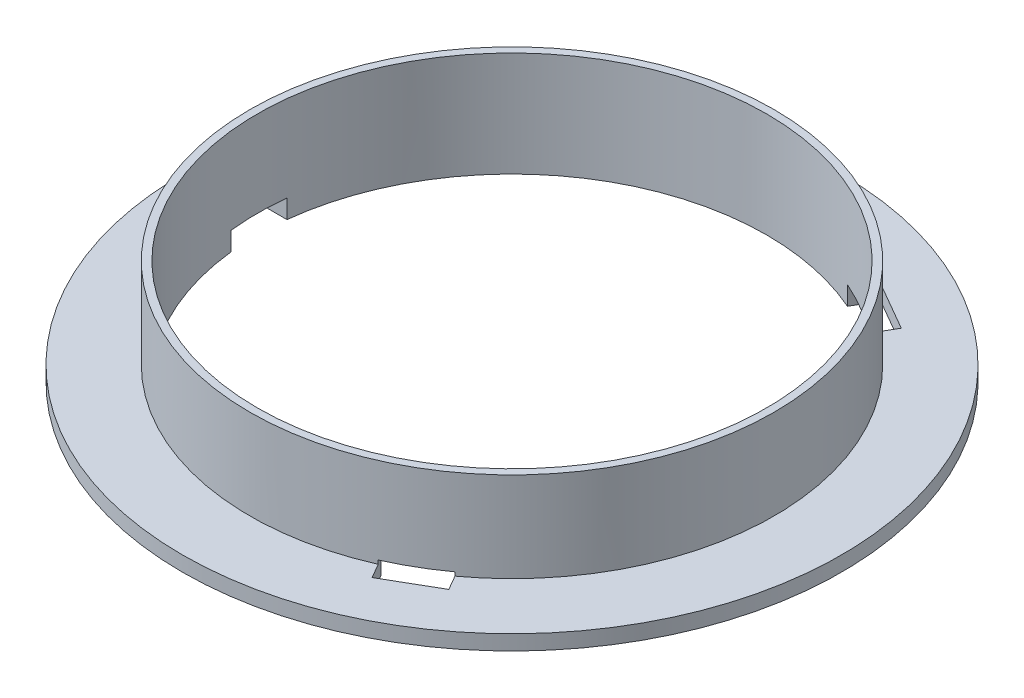
ISO-10303-21;
HEADER;
FILE_DESCRIPTION(('STEP AP214'),'2;1');
FILE_NAME('part.step','',(''),(''),'','','');
FILE_SCHEMA(('AUTOMOTIVE_DESIGN { 1 0 10303 214 1 1 1 1 }'));
ENDSEC;
DATA;
#1=APPLICATION_CONTEXT('core data for automotive mechanical design processes');
#2=APPLICATION_PROTOCOL_DEFINITION('international standard','automotive_design',2000,#1);
#3=PRODUCT_CONTEXT('',#1,'mechanical');
#4=PRODUCT('Part','Part','',(#3));
#5=PRODUCT_RELATED_PRODUCT_CATEGORY('part','',(#4));
#6=PRODUCT_DEFINITION_FORMATION('','',#4);
#7=PRODUCT_DEFINITION_CONTEXT('part definition',#1,'design');
#8=PRODUCT_DEFINITION('design','',#6,#7);
#9=PRODUCT_DEFINITION_SHAPE('','',#8);
#10=(LENGTH_UNIT() NAMED_UNIT(*) SI_UNIT(.MILLI.,.METRE.));
#11=(NAMED_UNIT(*) PLANE_ANGLE_UNIT() SI_UNIT($,.RADIAN.));
#12=(NAMED_UNIT(*) SI_UNIT($,.STERADIAN.) SOLID_ANGLE_UNIT());
#13=UNCERTAINTY_MEASURE_WITH_UNIT(LENGTH_MEASURE(1.E-05),#10,'distance_accuracy_value','');
#14=(GEOMETRIC_REPRESENTATION_CONTEXT(3) GLOBAL_UNCERTAINTY_ASSIGNED_CONTEXT((#13)) GLOBAL_UNIT_ASSIGNED_CONTEXT((#10,
#11,#12)) REPRESENTATION_CONTEXT('',''));
#15=CARTESIAN_POINT('',(0.,0.,0.));
#16=DIRECTION('',(0.,0.,1.));
#17=DIRECTION('',(1.,0.,0.));
#18=AXIS2_PLACEMENT_3D('',#15,#16,#17);
#19=CARTESIAN_POINT('',(0.,0.,0.));
#20=DIRECTION('',(0.,-1.,0.));
#21=DIRECTION('',(0.,0.,-1.));
#22=AXIS2_PLACEMENT_3D('',#19,#20,#21);
#23=CYLINDRICAL_SURFACE('',#22,34.);
#24=DIRECTION('',(0.,-1.,0.));
#25=VECTOR('',#24,1.);
#26=CARTESIAN_POINT('',(-33.7925657504724,2.5,-3.75));
#27=LINE('',#26,#25);
#28=CARTESIAN_POINT('',(-33.7925657504724,2.5,-3.75));
#29=VERTEX_POINT('',#28);
#30=CARTESIAN_POINT('',(-33.7925657504724,0.,-3.75));
#31=VERTEX_POINT('',#30);
#32=EDGE_CURVE('E270',#29,#31,#27,.T.);
#33=ORIENTED_EDGE('',*,*,#32,.T.);
#34=CARTESIAN_POINT('',(0.,0.,0.));
#35=DIRECTION('',(0.,-1.,0.));
#36=DIRECTION('',(0.,0.,-1.));
#37=AXIS2_PLACEMENT_3D('',#34,#35,#36);
#38=CIRCLE('',#37,34.);
#39=CARTESIAN_POINT('',(13.6486876110446,0.,-31.140220398965));
#40=VERTEX_POINT('',#39);
#41=EDGE_CURVE('E312',#31,#40,#38,.T.);
#42=ORIENTED_EDGE('',*,*,#41,.T.);
#43=DIRECTION('',(0.,-1.,0.));
#44=VECTOR('',#43,1.);
#45=CARTESIAN_POINT('',(13.6486876110446,2.5,-31.140220398965));
#46=LINE('',#45,#44);
#47=CARTESIAN_POINT('',(13.6486876110446,2.5,-31.140220398965));
#48=VERTEX_POINT('',#47);
#49=EDGE_CURVE('E248',#48,#40,#46,.T.);
#50=ORIENTED_EDGE('',*,*,#49,.F.);
#51=CARTESIAN_POINT('',(0.,2.5,0.));
#52=DIRECTION('',(0.,-1.,0.));
#53=DIRECTION('',(0.,0.,-1.));
#54=AXIS2_PLACEMENT_3D('',#51,#52,#53);
#55=CIRCLE('',#54,34.);
#56=CARTESIAN_POINT('',(20.1438781394279,2.5,-27.390220398965));
#57=VERTEX_POINT('',#56);
#58=EDGE_CURVE('E265',#48,#57,#55,.T.);
#59=ORIENTED_EDGE('',*,*,#58,.T.);
#60=DIRECTION('',(0.,-1.,0.));
#61=VECTOR('',#60,1.);
#62=CARTESIAN_POINT('',(20.1438781394279,2.5,-27.390220398965));
#63=LINE('',#62,#61);
#64=CARTESIAN_POINT('',(20.1438781394279,0.,-27.390220398965));
#65=VERTEX_POINT('',#64);
#66=EDGE_CURVE('E244',#57,#65,#63,.T.);
#67=ORIENTED_EDGE('',*,*,#66,.T.);
#68=CARTESIAN_POINT('',(20.1438781394278,0.,27.3902203989651));
#69=VERTEX_POINT('',#68);
#70=EDGE_CURVE('E316',#65,#69,#38,.T.);
#71=ORIENTED_EDGE('',*,*,#70,.T.);
#72=DIRECTION('',(0.,-1.,0.));
#73=VECTOR('',#72,1.);
#74=CARTESIAN_POINT('',(20.1438781394278,2.5,27.3902203989651));
#75=LINE('',#74,#73);
#76=CARTESIAN_POINT('',(20.1438781394278,2.5,27.3902203989651));
#77=VERTEX_POINT('',#76);
#78=EDGE_CURVE('E219',#77,#69,#75,.T.);
#79=ORIENTED_EDGE('',*,*,#78,.F.);
#80=CARTESIAN_POINT('',(0.,2.5,0.));
#81=DIRECTION('',(0.,-1.,0.));
#82=DIRECTION('',(0.,0.,-1.));
#83=AXIS2_PLACEMENT_3D('',#80,#81,#82);
#84=CIRCLE('',#83,34.);
#85=CARTESIAN_POINT('',(13.6486876110445,2.5,31.1402203989651));
#86=VERTEX_POINT('',#85);
#87=EDGE_CURVE('E276',#77,#86,#84,.T.);
#88=ORIENTED_EDGE('',*,*,#87,.T.);
#89=DIRECTION('',(0.,-1.,0.));
#90=VECTOR('',#89,1.);
#91=CARTESIAN_POINT('',(13.6486876110445,2.5,31.1402203989651));
#92=LINE('',#91,#90);
#93=CARTESIAN_POINT('',(13.6486876110445,0.,31.1402203989651));
#94=VERTEX_POINT('',#93);
#95=EDGE_CURVE('E216',#86,#94,#92,.T.);
#96=ORIENTED_EDGE('',*,*,#95,.T.);
#97=CARTESIAN_POINT('',(-33.7925657504724,0.,3.75));
#98=VERTEX_POINT('',#97);
#99=EDGE_CURVE('E198',#94,#98,#38,.T.);
#100=ORIENTED_EDGE('',*,*,#99,.T.);
#101=DIRECTION('',(0.,-1.,0.));
#102=VECTOR('',#101,1.);
#103=CARTESIAN_POINT('',(-33.7925657504724,2.5,3.75));
#104=LINE('',#103,#102);
#105=CARTESIAN_POINT('',(-33.7925657504724,2.5,3.75));
#106=VERTEX_POINT('',#105);
#107=EDGE_CURVE('E186',#106,#98,#104,.T.);
#108=ORIENTED_EDGE('',*,*,#107,.F.);
#109=CARTESIAN_POINT('',(0.,2.5,0.));
#110=DIRECTION('',(0.,1.,0.));
#111=DIRECTION('',(0.,0.,1.));
#112=AXIS2_PLACEMENT_3D('',#109,#110,#111);
#113=CIRCLE('',#112,34.);
#114=EDGE_CURVE('E168',#29,#106,#113,.T.);
#115=ORIENTED_EDGE('',*,*,#114,.F.);
#116=EDGE_LOOP('',(#33,#42,#50,#59,#67,#71,#79,#88,#96,#100,#108,#115));
#117=FACE_BOUND('',#116,.T.);
#118=CARTESIAN_POINT('',(0.,14.,0.));
#119=DIRECTION('',(0.,-1.,0.));
#120=DIRECTION('',(0.,0.,-1.));
#121=AXIS2_PLACEMENT_3D('',#118,#119,#120);
#122=CIRCLE('',#121,34.);
#123=CARTESIAN_POINT('',(0.,14.,-34.));
#124=VERTEX_POINT('',#123);
#125=EDGE_CURVE('E290',#124,#124,#122,.T.);
#126=ORIENTED_EDGE('',*,*,#125,.F.);
#127=EDGE_LOOP('',(#126));
#128=FACE_BOUND('',#127,.T.);
#129=ADVANCED_FACE('F43',(#117,#128),#23,.F.);
#130=CARTESIAN_POINT('',(0.,0.,-34.));
#131=DIRECTION('',(0.,-1.,0.));
#132=DIRECTION('',(0.,0.,-1.));
#133=AXIS2_PLACEMENT_3D('',#130,#131,#132);
#134=PLANE('',#133);
#135=DIRECTION('',(1.,0.,0.));
#136=VECTOR('',#135,1.);
#137=CARTESIAN_POINT('',(-37.0425657504724,0.,-3.75));
#138=LINE('',#137,#136);
#139=CARTESIAN_POINT('',(-37.0425657504724,0.,-3.75));
#140=VERTEX_POINT('',#139);
#141=EDGE_CURVE('E192',#140,#31,#138,.T.);
#142=ORIENTED_EDGE('',*,*,#141,.F.);
#143=DIRECTION('',(0.,0.,-1.));
#144=VECTOR('',#143,1.);
#145=CARTESIAN_POINT('',(-37.0425657504724,0.,-3.75));
#146=LINE('',#145,#144);
#147=CARTESIAN_POINT('',(-37.0425657504724,0.,3.75));
#148=VERTEX_POINT('',#147);
#149=EDGE_CURVE('E390',#148,#140,#146,.T.);
#150=ORIENTED_EDGE('',*,*,#149,.F.);
#151=DIRECTION('',(-1.,0.,0.));
#152=VECTOR('',#151,1.);
#153=CARTESIAN_POINT('',(-37.0425657504724,0.,3.75));
#154=LINE('',#153,#152);
#155=EDGE_CURVE('E232',#98,#148,#154,.T.);
#156=ORIENTED_EDGE('',*,*,#155,.F.);
#157=ORIENTED_EDGE('',*,*,#99,.F.);
#158=DIRECTION('',(-0.5,0.,-0.866025403784438));
#159=VECTOR('',#158,1.);
#160=CARTESIAN_POINT('',(15.2736876110445,0.,33.9548029612645));
#161=LINE('',#160,#159);
#162=CARTESIAN_POINT('',(15.2736876110445,0.,33.9548029612645));
#163=VERTEX_POINT('',#162);
#164=EDGE_CURVE('E222',#163,#94,#161,.T.);
#165=ORIENTED_EDGE('',*,*,#164,.F.);
#166=DIRECTION('',(-0.866025403784439,0.,0.5));
#167=VECTOR('',#166,1.);
#168=CARTESIAN_POINT('',(15.2736876110445,0.,33.9548029612645));
#169=LINE('',#168,#167);
#170=CARTESIAN_POINT('',(21.7688781394278,0.,30.2048029612645));
#171=VERTEX_POINT('',#170);
#172=EDGE_CURVE('E225',#171,#163,#169,.T.);
#173=ORIENTED_EDGE('',*,*,#172,.F.);
#174=DIRECTION('',(0.5,0.,0.866025403784438));
#175=VECTOR('',#174,1.);
#176=CARTESIAN_POINT('',(21.7688781394278,0.,30.2048029612645));
#177=LINE('',#176,#175);
#178=EDGE_CURVE('E58',#69,#171,#177,.T.);
#179=ORIENTED_EDGE('',*,*,#178,.F.);
#180=ORIENTED_EDGE('',*,*,#70,.F.);
#181=DIRECTION('',(-0.500000000000001,0.,0.866025403784438));
#182=VECTOR('',#181,1.);
#183=CARTESIAN_POINT('',(21.7688781394279,0.,-30.2048029612645));
#184=LINE('',#183,#182);
#185=CARTESIAN_POINT('',(21.7688781394279,0.,-30.2048029612645));
#186=VERTEX_POINT('',#185);
#187=EDGE_CURVE('E251',#186,#65,#184,.T.);
#188=ORIENTED_EDGE('',*,*,#187,.F.);
#189=DIRECTION('',(0.866025403784438,0.,0.500000000000001));
#190=VECTOR('',#189,1.);
#191=CARTESIAN_POINT('',(21.7688781394279,0.,-30.2048029612645));
#192=LINE('',#191,#190);
#193=CARTESIAN_POINT('',(15.2736876110446,0.,-33.9548029612645));
#194=VERTEX_POINT('',#193);
#195=EDGE_CURVE('E254',#194,#186,#192,.T.);
#196=ORIENTED_EDGE('',*,*,#195,.F.);
#197=DIRECTION('',(0.5,0.,-0.866025403784439));
#198=VECTOR('',#197,1.);
#199=CARTESIAN_POINT('',(15.2736876110446,0.,-33.9548029612645));
#200=LINE('',#199,#198);
#201=EDGE_CURVE('E66',#40,#194,#200,.T.);
#202=ORIENTED_EDGE('',*,*,#201,.F.);
#203=ORIENTED_EDGE('',*,*,#41,.F.);
#204=EDGE_LOOP('',(#142,#150,#156,#157,#165,#173,#179,#180,#188,#196,#202,#203));
#205=FACE_BOUND('',#204,.T.);
#206=CARTESIAN_POINT('',(0.,0.,0.));
#207=DIRECTION('',(0.,-1.,0.));
#208=DIRECTION('',(0.,0.,-1.));
#209=AXIS2_PLACEMENT_3D('',#206,#207,#208);
#210=CIRCLE('',#209,44.);
#211=CARTESIAN_POINT('',(0.,0.,-44.));
#212=VERTEX_POINT('',#211);
#213=EDGE_CURVE('E308',#212,#212,#210,.T.);
#214=ORIENTED_EDGE('',*,*,#213,.T.);
#215=EDGE_LOOP('',(#214));
#216=FACE_BOUND('',#215,.T.);
#217=ADVANCED_FACE('F398',(#205,#216),#134,.T.);
#218=CARTESIAN_POINT('',(0.,0.,0.));
#219=DIRECTION('',(0.,-1.,0.));
#220=DIRECTION('',(0.,0.,-1.));
#221=AXIS2_PLACEMENT_3D('',#218,#219,#220);
#222=CYLINDRICAL_SURFACE('',#221,44.);
#223=CARTESIAN_POINT('',(0.,2.,0.));
#224=DIRECTION('',(0.,-1.,0.));
#225=DIRECTION('',(0.,0.,-1.));
#226=AXIS2_PLACEMENT_3D('',#223,#224,#225);
#227=CIRCLE('',#226,44.);
#228=CARTESIAN_POINT('',(0.,2.,-44.));
#229=VERTEX_POINT('',#228);
#230=EDGE_CURVE('E304',#229,#229,#227,.T.);
#231=ORIENTED_EDGE('',*,*,#230,.T.);
#232=EDGE_LOOP('',(#231));
#233=FACE_BOUND('',#232,.T.);
#234=ORIENTED_EDGE('',*,*,#213,.F.);
#235=EDGE_LOOP('',(#234));
#236=FACE_BOUND('',#235,.T.);
#237=ADVANCED_FACE('F445',(#233,#236),#222,.T.);
#238=CARTESIAN_POINT('',(0.,2.,-44.));
#239=DIRECTION('',(0.,1.,0.));
#240=DIRECTION('',(0.,0.,1.));
#241=AXIS2_PLACEMENT_3D('',#238,#239,#240);
#242=PLANE('',#241);
#243=DIRECTION('',(-1.,0.,0.));
#244=VECTOR('',#243,1.);
#245=CARTESIAN_POINT('',(0.,2.,-3.74999999999999));
#246=LINE('',#245,#244);
#247=CARTESIAN_POINT('',(-34.7985272676876,2.,-3.75));
#248=VERTEX_POINT('',#247);
#249=CARTESIAN_POINT('',(-37.0425657504724,2.,-3.75));
#250=VERTEX_POINT('',#249);
#251=EDGE_CURVE('E287',#248,#250,#246,.T.);
#252=ORIENTED_EDGE('',*,*,#251,.F.);
#253=CARTESIAN_POINT('',(0.,2.,0.));
#254=DIRECTION('',(0.,-1.,0.));
#255=DIRECTION('',(0.,0.,-1.));
#256=AXIS2_PLACEMENT_3D('',#253,#254,#255);
#257=CIRCLE('',#256,35.);
#258=CARTESIAN_POINT('',(14.1516683696522,2.,-32.011408628103));
#259=VERTEX_POINT('',#258);
#260=EDGE_CURVE('E298',#248,#259,#257,.T.);
#261=ORIENTED_EDGE('',*,*,#260,.T.);
#262=DIRECTION('',(-0.5,0.,0.866025403784439));
#263=VECTOR('',#262,1.);
#264=CARTESIAN_POINT('',(15.804963619066,2.,-34.875));
#265=LINE('',#264,#263);
#266=CARTESIAN_POINT('',(15.2736876110446,2.,-33.9548029612645));
#267=VERTEX_POINT('',#266);
#268=EDGE_CURVE('E273',#267,#259,#265,.T.);
#269=ORIENTED_EDGE('',*,*,#268,.F.);
#270=DIRECTION('',(-0.866025403784438,0.,-0.500000000000001));
#271=VECTOR('',#270,1.);
#272=CARTESIAN_POINT('',(-0.531276008021443,2.,-43.0798029612645));
#273=LINE('',#272,#271);
#274=CARTESIAN_POINT('',(21.7688781394279,2.,-30.2048029612645));
#275=VERTEX_POINT('',#274);
#276=EDGE_CURVE('E347',#275,#267,#273,.T.);
#277=ORIENTED_EDGE('',*,*,#276,.F.);
#278=DIRECTION('',(0.500000000000001,0.,-0.866025403784438));
#279=VECTOR('',#278,1.);
#280=CARTESIAN_POINT('',(22.3001541474493,2.,-31.125));
#281=LINE('',#280,#279);
#282=CARTESIAN_POINT('',(20.6468588980355,2.,-28.261408628103));
#283=VERTEX_POINT('',#282);
#284=EDGE_CURVE('E269',#283,#275,#281,.T.);
#285=ORIENTED_EDGE('',*,*,#284,.F.);
#286=CARTESIAN_POINT('',(20.6468588980355,2.,28.261408628103));
#287=VERTEX_POINT('',#286);
#288=EDGE_CURVE('E303',#283,#287,#257,.T.);
#289=ORIENTED_EDGE('',*,*,#288,.T.);
#290=DIRECTION('',(-0.5,0.,-0.866025403784438));
#291=VECTOR('',#290,1.);
#292=CARTESIAN_POINT('',(-15.804963619066,2.,-34.875));
#293=LINE('',#292,#291);
#294=CARTESIAN_POINT('',(21.7688781394278,2.,30.2048029612645));
#295=VERTEX_POINT('',#294);
#296=EDGE_CURVE('E181',#295,#287,#293,.T.);
#297=ORIENTED_EDGE('',*,*,#296,.F.);
#298=DIRECTION('',(0.866025403784439,0.,-0.5));
#299=VECTOR('',#298,1.);
#300=CARTESIAN_POINT('',(37.5738417584938,2.,21.0798029612645));
#301=LINE('',#300,#299);
#302=CARTESIAN_POINT('',(15.2736876110445,2.,33.9548029612645));
#303=VERTEX_POINT('',#302);
#304=EDGE_CURVE('E51',#303,#295,#301,.T.);
#305=ORIENTED_EDGE('',*,*,#304,.F.);
#306=DIRECTION('',(0.5,0.,0.866025403784438));
#307=VECTOR('',#306,1.);
#308=CARTESIAN_POINT('',(-22.3001541474493,2.,-31.125));
#309=LINE('',#308,#307);
#310=CARTESIAN_POINT('',(14.1516683696522,2.,32.011408628103));
#311=VERTEX_POINT('',#310);
#312=EDGE_CURVE('E280',#311,#303,#309,.T.);
#313=ORIENTED_EDGE('',*,*,#312,.F.);
#314=CARTESIAN_POINT('',(-34.7985272676876,2.,3.75));
#315=VERTEX_POINT('',#314);
#316=EDGE_CURVE('E302',#311,#315,#257,.T.);
#317=ORIENTED_EDGE('',*,*,#316,.T.);
#318=DIRECTION('',(1.,0.,0.));
#319=VECTOR('',#318,1.);
#320=CARTESIAN_POINT('',(0.,2.,3.75));
#321=LINE('',#320,#319);
#322=CARTESIAN_POINT('',(-37.0425657504724,2.,3.75));
#323=VERTEX_POINT('',#322);
#324=EDGE_CURVE('E180',#323,#315,#321,.T.);
#325=ORIENTED_EDGE('',*,*,#324,.F.);
#326=DIRECTION('',(0.,0.,1.));
#327=VECTOR('',#326,1.);
#328=CARTESIAN_POINT('',(-37.0425657504724,2.,-44.));
#329=LINE('',#328,#327);
#330=EDGE_CURVE('E11',#250,#323,#329,.T.);
#331=ORIENTED_EDGE('',*,*,#330,.F.);
#332=EDGE_LOOP('',(#252,#261,#269,#277,#285,#289,#297,#305,#313,#317,#325,#331));
#333=FACE_BOUND('',#332,.T.);
#334=ORIENTED_EDGE('',*,*,#230,.F.);
#335=EDGE_LOOP('',(#334));
#336=FACE_BOUND('',#335,.T.);
#337=ADVANCED_FACE('F362',(#333,#336),#242,.T.);
#338=CARTESIAN_POINT('',(0.,0.,0.));
#339=DIRECTION('',(0.,-1.,0.));
#340=DIRECTION('',(0.,0.,-1.));
#341=AXIS2_PLACEMENT_3D('',#338,#339,#340);
#342=CYLINDRICAL_SURFACE('',#341,35.);
#343=DIRECTION('',(0.,-1.,0.));
#344=VECTOR('',#343,1.);
#345=CARTESIAN_POINT('',(-34.7985272676876,0.,-3.75));
#346=LINE('',#345,#344);
#347=CARTESIAN_POINT('',(-34.7985272676876,2.5,-3.75));
#348=VERTEX_POINT('',#347);
#349=EDGE_CURVE('E344',#348,#248,#346,.T.);
#350=ORIENTED_EDGE('',*,*,#349,.F.);
#351=CARTESIAN_POINT('',(0.,2.5,0.));
#352=DIRECTION('',(0.,1.,0.));
#353=DIRECTION('',(0.,0.,1.));
#354=AXIS2_PLACEMENT_3D('',#351,#352,#353);
#355=CIRCLE('',#354,35.);
#356=CARTESIAN_POINT('',(-34.7985272676876,2.5,3.75));
#357=VERTEX_POINT('',#356);
#358=EDGE_CURVE('E339',#357,#348,#355,.F.);
#359=ORIENTED_EDGE('',*,*,#358,.F.);
#360=DIRECTION('',(0.,-1.,0.));
#361=VECTOR('',#360,1.);
#362=CARTESIAN_POINT('',(-34.7985272676876,0.,3.75));
#363=LINE('',#362,#361);
#364=EDGE_CURVE('E189',#315,#357,#363,.F.);
#365=ORIENTED_EDGE('',*,*,#364,.F.);
#366=ORIENTED_EDGE('',*,*,#316,.F.);
#367=DIRECTION('',(0.,-1.,0.));
#368=VECTOR('',#367,1.);
#369=CARTESIAN_POINT('',(14.1516683696522,0.,32.011408628103));
#370=LINE('',#369,#368);
#371=CARTESIAN_POINT('',(14.1516683696522,2.5,32.011408628103));
#372=VERTEX_POINT('',#371);
#373=EDGE_CURVE('E332',#372,#311,#370,.T.);
#374=ORIENTED_EDGE('',*,*,#373,.F.);
#375=CARTESIAN_POINT('',(0.,2.5,0.));
#376=DIRECTION('',(0.,-1.,0.));
#377=DIRECTION('',(0.,0.,-1.));
#378=AXIS2_PLACEMENT_3D('',#375,#376,#377);
#379=CIRCLE('',#378,35.);
#380=CARTESIAN_POINT('',(20.6468588980355,2.5,28.261408628103));
#381=VERTEX_POINT('',#380);
#382=EDGE_CURVE('E328',#372,#381,#379,.F.);
#383=ORIENTED_EDGE('',*,*,#382,.T.);
#384=DIRECTION('',(0.,-1.,0.));
#385=VECTOR('',#384,1.);
#386=CARTESIAN_POINT('',(20.6468588980355,0.,28.261408628103));
#387=LINE('',#386,#385);
#388=EDGE_CURVE('E335',#287,#381,#387,.F.);
#389=ORIENTED_EDGE('',*,*,#388,.F.);
#390=ORIENTED_EDGE('',*,*,#288,.F.);
#391=DIRECTION('',(0.,-1.,0.));
#392=VECTOR('',#391,1.);
#393=CARTESIAN_POINT('',(20.6468588980355,0.,-28.261408628103));
#394=LINE('',#393,#392);
#395=CARTESIAN_POINT('',(20.6468588980355,2.5,-28.261408628103));
#396=VERTEX_POINT('',#395);
#397=EDGE_CURVE('E321',#396,#283,#394,.T.);
#398=ORIENTED_EDGE('',*,*,#397,.F.);
#399=CARTESIAN_POINT('',(0.,2.5,0.));
#400=DIRECTION('',(0.,-1.,0.));
#401=DIRECTION('',(0.,0.,-1.));
#402=AXIS2_PLACEMENT_3D('',#399,#400,#401);
#403=CIRCLE('',#402,35.);
#404=CARTESIAN_POINT('',(14.1516683696522,2.5,-32.011408628103));
#405=VERTEX_POINT('',#404);
#406=EDGE_CURVE('E317',#396,#405,#403,.F.);
#407=ORIENTED_EDGE('',*,*,#406,.T.);
#408=DIRECTION('',(0.,-1.,0.));
#409=VECTOR('',#408,1.);
#410=CARTESIAN_POINT('',(14.1516683696522,0.,-32.011408628103));
#411=LINE('',#410,#409);
#412=EDGE_CURVE('E324',#259,#405,#411,.F.);
#413=ORIENTED_EDGE('',*,*,#412,.F.);
#414=ORIENTED_EDGE('',*,*,#260,.F.);
#415=EDGE_LOOP('',(#350,#359,#365,#366,#374,#383,#389,#390,#398,#407,#413,#414));
#416=FACE_BOUND('',#415,.T.);
#417=CARTESIAN_POINT('',(0.,14.,0.));
#418=DIRECTION('',(0.,-1.,0.));
#419=DIRECTION('',(0.,0.,-1.));
#420=AXIS2_PLACEMENT_3D('',#417,#418,#419);
#421=CIRCLE('',#420,35.);
#422=CARTESIAN_POINT('',(0.,14.,-35.));
#423=VERTEX_POINT('',#422);
#424=EDGE_CURVE('E294',#423,#423,#421,.T.);
#425=ORIENTED_EDGE('',*,*,#424,.T.);
#426=EDGE_LOOP('',(#425));
#427=FACE_BOUND('',#426,.T.);
#428=ADVANCED_FACE('F377',(#416,#427),#342,.T.);
#429=CARTESIAN_POINT('',(0.,14.,-35.));
#430=DIRECTION('',(0.,1.,0.));
#431=DIRECTION('',(0.,0.,1.));
#432=AXIS2_PLACEMENT_3D('',#429,#430,#431);
#433=PLANE('',#432);
#434=ORIENTED_EDGE('',*,*,#125,.T.);
#435=EDGE_LOOP('',(#434));
#436=FACE_BOUND('',#435,.T.);
#437=ORIENTED_EDGE('',*,*,#424,.F.);
#438=EDGE_LOOP('',(#437));
#439=FACE_BOUND('',#438,.T.);
#440=ADVANCED_FACE('F456',(#436,#439),#433,.T.);
#441=CARTESIAN_POINT('',(15.2736876110446,2.5,-33.9548029612645));
#442=DIRECTION('',(-0.866025403784439,0.,-0.5));
#443=DIRECTION('',(-0.5,0.,0.866025403784439));
#444=AXIS2_PLACEMENT_3D('',#441,#442,#443);
#445=PLANE('',#444);
#446=ORIENTED_EDGE('',*,*,#268,.T.);
#447=ORIENTED_EDGE('',*,*,#412,.T.);
#448=DIRECTION('',(0.5,0.,-0.866025403784439));
#449=VECTOR('',#448,1.);
#450=CARTESIAN_POINT('',(15.2736876110446,2.5,-33.9548029612645));
#451=LINE('',#450,#449);
#452=EDGE_CURVE('E255',#48,#405,#451,.T.);
#453=ORIENTED_EDGE('',*,*,#452,.F.);
#454=ORIENTED_EDGE('',*,*,#49,.T.);
#455=ORIENTED_EDGE('',*,*,#201,.T.);
#456=DIRECTION('',(0.,-1.,0.));
#457=VECTOR('',#456,1.);
#458=CARTESIAN_POINT('',(15.2736876110446,2.5,-33.9548029612645));
#459=LINE('',#458,#457);
#460=EDGE_CURVE('E237',#267,#194,#459,.T.);
#461=ORIENTED_EDGE('',*,*,#460,.F.);
#462=EDGE_LOOP('',(#446,#447,#453,#454,#455,#461));
#463=FACE_BOUND('',#462,.T.);
#464=ADVANCED_FACE('F406',(#463),#445,.F.);
#465=CARTESIAN_POINT('',(21.7688781394279,2.5,-30.2048029612645));
#466=DIRECTION('',(0.866025403784438,0.,0.500000000000001));
#467=DIRECTION('',(0.500000000000001,0.,-0.866025403784438));
#468=AXIS2_PLACEMENT_3D('',#465,#466,#467);
#469=PLANE('',#468);
#470=ORIENTED_EDGE('',*,*,#284,.T.);
#471=DIRECTION('',(0.,-1.,0.));
#472=VECTOR('',#471,1.);
#473=CARTESIAN_POINT('',(21.7688781394279,2.5,-30.2048029612645));
#474=LINE('',#473,#472);
#475=EDGE_CURVE('E241',#275,#186,#474,.T.);
#476=ORIENTED_EDGE('',*,*,#475,.T.);
#477=ORIENTED_EDGE('',*,*,#187,.T.);
#478=ORIENTED_EDGE('',*,*,#66,.F.);
#479=DIRECTION('',(-0.500000000000001,0.,0.866025403784438));
#480=VECTOR('',#479,1.);
#481=CARTESIAN_POINT('',(21.7688781394279,2.5,-30.2048029612645));
#482=LINE('',#481,#480);
#483=EDGE_CURVE('E240',#396,#57,#482,.T.);
#484=ORIENTED_EDGE('',*,*,#483,.F.);
#485=ORIENTED_EDGE('',*,*,#397,.T.);
#486=EDGE_LOOP('',(#470,#476,#477,#478,#484,#485));
#487=FACE_BOUND('',#486,.T.);
#488=ADVANCED_FACE('F414',(#487),#469,.F.);
#489=CARTESIAN_POINT('',(21.7688781394279,2.5,-30.2048029612645));
#490=DIRECTION('',(0.500000000000001,0.,-0.866025403784438));
#491=DIRECTION('',(-0.866025403784438,0.,-0.500000000000001));
#492=AXIS2_PLACEMENT_3D('',#489,#490,#491);
#493=PLANE('',#492);
#494=ORIENTED_EDGE('',*,*,#276,.T.);
#495=ORIENTED_EDGE('',*,*,#460,.T.);
#496=ORIENTED_EDGE('',*,*,#195,.T.);
#497=ORIENTED_EDGE('',*,*,#475,.F.);
#498=EDGE_LOOP('',(#494,#495,#496,#497));
#499=FACE_BOUND('',#498,.T.);
#500=ADVANCED_FACE('F410',(#499),#493,.F.);
#501=CARTESIAN_POINT('',(0.,2.5,0.));
#502=DIRECTION('',(0.,-1.,0.));
#503=DIRECTION('',(0.,0.,-1.));
#504=AXIS2_PLACEMENT_3D('',#501,#502,#503);
#505=PLANE('',#504);
#506=ORIENTED_EDGE('',*,*,#452,.T.);
#507=ORIENTED_EDGE('',*,*,#406,.F.);
#508=ORIENTED_EDGE('',*,*,#483,.T.);
#509=ORIENTED_EDGE('',*,*,#58,.F.);
#510=EDGE_LOOP('',(#506,#507,#508,#509));
#511=FACE_BOUND('',#510,.T.);
#512=ADVANCED_FACE('F418',(#511),#505,.T.);
#513=CARTESIAN_POINT('',(21.7688781394278,2.5,30.2048029612645));
#514=DIRECTION('',(0.866025403784438,0.,-0.5));
#515=DIRECTION('',(-0.5,0.,-0.866025403784438));
#516=AXIS2_PLACEMENT_3D('',#513,#514,#515);
#517=PLANE('',#516);
#518=ORIENTED_EDGE('',*,*,#296,.T.);
#519=ORIENTED_EDGE('',*,*,#388,.T.);
#520=DIRECTION('',(0.5,0.,0.866025403784438));
#521=VECTOR('',#520,1.);
#522=CARTESIAN_POINT('',(21.7688781394278,2.5,30.2048029612645));
#523=LINE('',#522,#521);
#524=EDGE_CURVE('E226',#77,#381,#523,.T.);
#525=ORIENTED_EDGE('',*,*,#524,.F.);
#526=ORIENTED_EDGE('',*,*,#78,.T.);
#527=ORIENTED_EDGE('',*,*,#178,.T.);
#528=DIRECTION('',(0.,-1.,0.));
#529=VECTOR('',#528,1.);
#530=CARTESIAN_POINT('',(21.7688781394278,2.5,30.2048029612645));
#531=LINE('',#530,#529);
#532=EDGE_CURVE('E209',#295,#171,#531,.T.);
#533=ORIENTED_EDGE('',*,*,#532,.F.);
#534=EDGE_LOOP('',(#518,#519,#525,#526,#527,#533));
#535=FACE_BOUND('',#534,.T.);
#536=ADVANCED_FACE('F358',(#535),#517,.F.);
#537=CARTESIAN_POINT('',(15.2736876110445,2.5,33.9548029612645));
#538=DIRECTION('',(-0.866025403784438,0.,0.5));
#539=DIRECTION('',(0.5,0.,0.866025403784438));
#540=AXIS2_PLACEMENT_3D('',#537,#538,#539);
#541=PLANE('',#540);
#542=ORIENTED_EDGE('',*,*,#312,.T.);
#543=DIRECTION('',(0.,-1.,0.));
#544=VECTOR('',#543,1.);
#545=CARTESIAN_POINT('',(15.2736876110445,2.5,33.9548029612645));
#546=LINE('',#545,#544);
#547=EDGE_CURVE('E213',#303,#163,#546,.T.);
#548=ORIENTED_EDGE('',*,*,#547,.T.);
#549=ORIENTED_EDGE('',*,*,#164,.T.);
#550=ORIENTED_EDGE('',*,*,#95,.F.);
#551=DIRECTION('',(-0.5,0.,-0.866025403784438));
#552=VECTOR('',#551,1.);
#553=CARTESIAN_POINT('',(15.2736876110445,2.5,33.9548029612645));
#554=LINE('',#553,#552);
#555=EDGE_CURVE('E212',#372,#86,#554,.T.);
#556=ORIENTED_EDGE('',*,*,#555,.F.);
#557=ORIENTED_EDGE('',*,*,#373,.T.);
#558=EDGE_LOOP('',(#542,#548,#549,#550,#556,#557));
#559=FACE_BOUND('',#558,.T.);
#560=ADVANCED_FACE('F430',(#559),#541,.F.);
#561=CARTESIAN_POINT('',(15.2736876110445,2.5,33.9548029612645));
#562=DIRECTION('',(0.5,0.,0.866025403784439));
#563=DIRECTION('',(0.866025403784439,0.,-0.5));
#564=AXIS2_PLACEMENT_3D('',#561,#562,#563);
#565=PLANE('',#564);
#566=ORIENTED_EDGE('',*,*,#304,.T.);
#567=ORIENTED_EDGE('',*,*,#532,.T.);
#568=ORIENTED_EDGE('',*,*,#172,.T.);
#569=ORIENTED_EDGE('',*,*,#547,.F.);
#570=EDGE_LOOP('',(#566,#567,#568,#569));
#571=FACE_BOUND('',#570,.T.);
#572=ADVANCED_FACE('F353',(#571),#565,.F.);
#573=CARTESIAN_POINT('',(0.,2.5,0.));
#574=DIRECTION('',(0.,-1.,0.));
#575=DIRECTION('',(0.,0.,-1.));
#576=AXIS2_PLACEMENT_3D('',#573,#574,#575);
#577=PLANE('',#576);
#578=ORIENTED_EDGE('',*,*,#524,.T.);
#579=ORIENTED_EDGE('',*,*,#382,.F.);
#580=ORIENTED_EDGE('',*,*,#555,.T.);
#581=ORIENTED_EDGE('',*,*,#87,.F.);
#582=EDGE_LOOP('',(#578,#579,#580,#581));
#583=FACE_BOUND('',#582,.T.);
#584=ADVANCED_FACE('F426',(#583),#577,.T.);
#585=CARTESIAN_POINT('',(-37.0425657504724,2.5,-3.75));
#586=DIRECTION('',(0.,0.,-1.));
#587=DIRECTION('',(-1.,0.,0.));
#588=AXIS2_PLACEMENT_3D('',#585,#586,#587);
#589=PLANE('',#588);
#590=ORIENTED_EDGE('',*,*,#251,.T.);
#591=DIRECTION('',(0.,-1.,0.));
#592=VECTOR('',#591,1.);
#593=CARTESIAN_POINT('',(-37.0425657504724,2.5,-3.75));
#594=LINE('',#593,#592);
#595=EDGE_CURVE('E204',#250,#140,#594,.T.);
#596=ORIENTED_EDGE('',*,*,#595,.T.);
#597=ORIENTED_EDGE('',*,*,#141,.T.);
#598=ORIENTED_EDGE('',*,*,#32,.F.);
#599=DIRECTION('',(1.,0.,0.));
#600=VECTOR('',#599,1.);
#601=CARTESIAN_POINT('',(-37.0425657504724,2.5,-3.75));
#602=LINE('',#601,#600);
#603=EDGE_CURVE('E174',#348,#29,#602,.T.);
#604=ORIENTED_EDGE('',*,*,#603,.F.);
#605=ORIENTED_EDGE('',*,*,#349,.T.);
#606=EDGE_LOOP('',(#590,#596,#597,#598,#604,#605));
#607=FACE_BOUND('',#606,.T.);
#608=ADVANCED_FACE('F381',(#607),#589,.F.);
#609=CARTESIAN_POINT('',(-37.0425657504724,2.5,-3.75));
#610=DIRECTION('',(-1.,0.,0.));
#611=DIRECTION('',(0.,0.,1.));
#612=AXIS2_PLACEMENT_3D('',#609,#610,#611);
#613=PLANE('',#612);
#614=ORIENTED_EDGE('',*,*,#330,.T.);
#615=DIRECTION('',(0.,-1.,0.));
#616=VECTOR('',#615,1.);
#617=CARTESIAN_POINT('',(-37.0425657504724,2.5,3.75));
#618=LINE('',#617,#616);
#619=EDGE_CURVE('E200',#323,#148,#618,.T.);
#620=ORIENTED_EDGE('',*,*,#619,.T.);
#621=ORIENTED_EDGE('',*,*,#149,.T.);
#622=ORIENTED_EDGE('',*,*,#595,.F.);
#623=EDGE_LOOP('',(#614,#620,#621,#622));
#624=FACE_BOUND('',#623,.T.);
#625=ADVANCED_FACE('F402',(#624),#613,.F.);
#626=CARTESIAN_POINT('',(-37.0425657504724,2.5,3.75));
#627=DIRECTION('',(0.,0.,1.));
#628=DIRECTION('',(1.,0.,0.));
#629=AXIS2_PLACEMENT_3D('',#626,#627,#628);
#630=PLANE('',#629);
#631=ORIENTED_EDGE('',*,*,#324,.T.);
#632=ORIENTED_EDGE('',*,*,#364,.T.);
#633=DIRECTION('',(-1.,0.,0.));
#634=VECTOR('',#633,1.);
#635=CARTESIAN_POINT('',(-37.0425657504724,2.5,3.75));
#636=LINE('',#635,#634);
#637=EDGE_CURVE('E171',#106,#357,#636,.T.);
#638=ORIENTED_EDGE('',*,*,#637,.F.);
#639=ORIENTED_EDGE('',*,*,#107,.T.);
#640=ORIENTED_EDGE('',*,*,#155,.T.);
#641=ORIENTED_EDGE('',*,*,#619,.F.);
#642=EDGE_LOOP('',(#631,#632,#638,#639,#640,#641));
#643=FACE_BOUND('',#642,.T.);
#644=ADVANCED_FACE('F184',(#643),#630,.F.);
#645=CARTESIAN_POINT('',(0.,2.5,0.));
#646=DIRECTION('',(0.,1.,0.));
#647=DIRECTION('',(0.,0.,1.));
#648=AXIS2_PLACEMENT_3D('',#645,#646,#647);
#649=PLANE('',#648);
#650=ORIENTED_EDGE('',*,*,#114,.T.);
#651=ORIENTED_EDGE('',*,*,#637,.T.);
#652=ORIENTED_EDGE('',*,*,#358,.T.);
#653=ORIENTED_EDGE('',*,*,#603,.T.);
#654=EDGE_LOOP('',(#650,#651,#652,#653));
#655=FACE_BOUND('',#654,.T.);
#656=ADVANCED_FACE('F170',(#655),#649,.F.);
#657=CLOSED_SHELL('',(#129,#217,#237,#337,#428,#440,#464,#488,#500,#512,#536,#560,#572,#584,
#608,#625,#644,#656));
#658=MANIFOLD_SOLID_BREP('B2',#657);
#659=ADVANCED_BREP_SHAPE_REPRESENTATION('',(#18,#658),#14);
#660=SHAPE_DEFINITION_REPRESENTATION(#9,#659);
ENDSEC;
END-ISO-10303-21;
